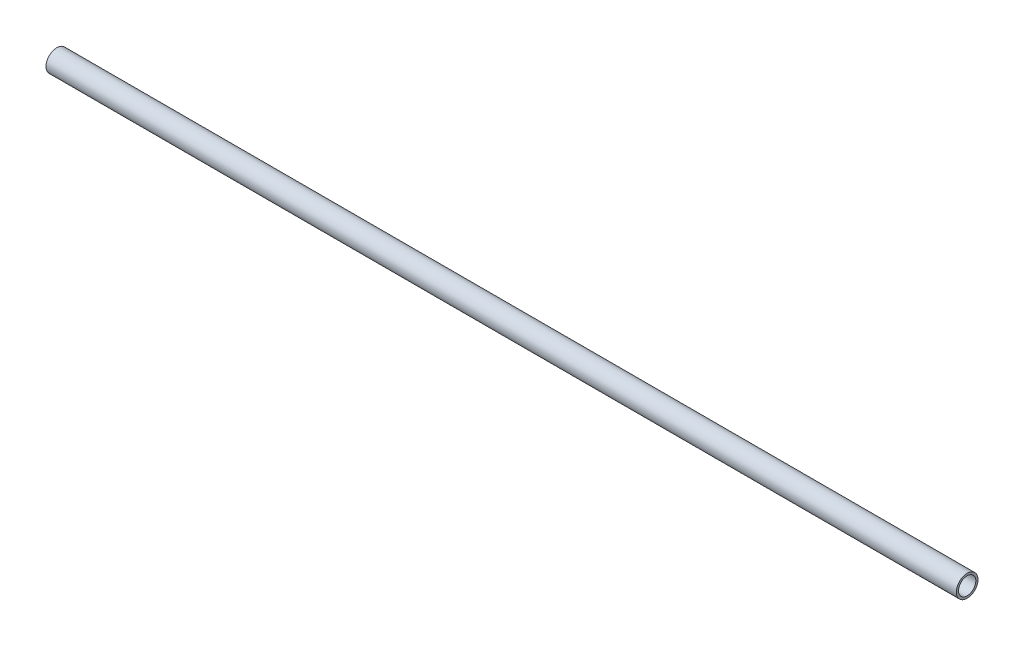
ISO-10303-21;
HEADER;
FILE_DESCRIPTION(('STEP AP214'),'2;1');
FILE_NAME('part.step','',(''),(''),'','','');
FILE_SCHEMA(('AUTOMOTIVE_DESIGN { 1 0 10303 214 1 1 1 1 }'));
ENDSEC;
DATA;
#1=APPLICATION_CONTEXT('core data for automotive mechanical design processes');
#2=APPLICATION_PROTOCOL_DEFINITION('international standard','automotive_design',2000,#1);
#3=PRODUCT_CONTEXT('',#1,'mechanical');
#4=PRODUCT('Part','Part','',(#3));
#5=PRODUCT_RELATED_PRODUCT_CATEGORY('part','',(#4));
#6=PRODUCT_DEFINITION_FORMATION('','',#4);
#7=PRODUCT_DEFINITION_CONTEXT('part definition',#1,'design');
#8=PRODUCT_DEFINITION('design','',#6,#7);
#9=PRODUCT_DEFINITION_SHAPE('','',#8);
#10=(LENGTH_UNIT() NAMED_UNIT(*) SI_UNIT(.MILLI.,.METRE.));
#11=(NAMED_UNIT(*) PLANE_ANGLE_UNIT() SI_UNIT($,.RADIAN.));
#12=(NAMED_UNIT(*) SI_UNIT($,.STERADIAN.) SOLID_ANGLE_UNIT());
#13=UNCERTAINTY_MEASURE_WITH_UNIT(LENGTH_MEASURE(1.E-05),#10,'distance_accuracy_value','');
#14=(GEOMETRIC_REPRESENTATION_CONTEXT(3) GLOBAL_UNCERTAINTY_ASSIGNED_CONTEXT((#13)) GLOBAL_UNIT_ASSIGNED_CONTEXT((#10,
#11,#12)) REPRESENTATION_CONTEXT('',''));
#15=CARTESIAN_POINT('',(0.,0.,0.));
#16=DIRECTION('',(0.,0.,1.));
#17=DIRECTION('',(1.,0.,0.));
#18=AXIS2_PLACEMENT_3D('',#15,#16,#17);
#19=CARTESIAN_POINT('',(-211.,0.,-44.));
#20=DIRECTION('',(-1.,0.,0.));
#21=DIRECTION('',(0.,1.,0.));
#22=AXIS2_PLACEMENT_3D('',#19,#20,#21);
#23=CYLINDRICAL_SURFACE('',#22,4.);
#24=CARTESIAN_POINT('',(-210.,0.,-44.));
#25=DIRECTION('',(-1.,0.,0.));
#26=DIRECTION('',(0.,1.,0.));
#27=AXIS2_PLACEMENT_3D('',#24,#25,#26);
#28=CIRCLE('',#27,4.);
#29=CARTESIAN_POINT('',(-210.,4.,-44.));
#30=VERTEX_POINT('',#29);
#31=EDGE_CURVE('E61',#30,#30,#28,.T.);
#32=ORIENTED_EDGE('',*,*,#31,.T.);
#33=DIRECTION('',(1.,0.,0.));
#34=VECTOR('',#33,1.);
#35=CARTESIAN_POINT('',(-211.,4.,-44.));
#36=LINE('',#35,#34);
#37=CARTESIAN_POINT('',(210.,4.,-44.));
#38=VERTEX_POINT('',#37);
#39=EDGE_CURVE('E9',#30,#38,#36,.T.);
#40=ORIENTED_EDGE('',*,*,#39,.T.);
#41=CARTESIAN_POINT('',(210.,0.,-44.));
#42=DIRECTION('',(-1.,0.,0.));
#43=DIRECTION('',(0.,1.,0.));
#44=AXIS2_PLACEMENT_3D('',#41,#42,#43);
#45=CIRCLE('',#44,4.);
#46=EDGE_CURVE('E24',#38,#38,#45,.T.);
#47=ORIENTED_EDGE('',*,*,#46,.F.);
#48=ORIENTED_EDGE('',*,*,#39,.F.);
#49=EDGE_LOOP('',(#32,#40,#47,#48));
#50=FACE_BOUND('',#49,.T.);
#51=ADVANCED_FACE('F15',(#50),#23,.F.);
#52=CARTESIAN_POINT('',(210.,0.,-44.));
#53=DIRECTION('',(1.,0.,0.));
#54=DIRECTION('',(0.,1.,0.));
#55=AXIS2_PLACEMENT_3D('',#52,#53,#54);
#56=PLANE('',#55);
#57=ORIENTED_EDGE('',*,*,#46,.T.);
#58=EDGE_LOOP('',(#57));
#59=FACE_BOUND('',#58,.T.);
#60=CARTESIAN_POINT('',(210.,0.,-44.));
#61=DIRECTION('',(1.,0.,0.));
#62=DIRECTION('',(0.,1.,0.));
#63=AXIS2_PLACEMENT_3D('',#60,#61,#62);
#64=CIRCLE('',#63,5.);
#65=CARTESIAN_POINT('',(210.,5.,-44.));
#66=VERTEX_POINT('',#65);
#67=EDGE_CURVE('E55',#66,#66,#64,.T.);
#68=ORIENTED_EDGE('',*,*,#67,.T.);
#69=EDGE_LOOP('',(#68));
#70=FACE_BOUND('',#69,.T.);
#71=ADVANCED_FACE('F17',(#59,#70),#56,.T.);
#72=CARTESIAN_POINT('',(-210.,0.,-44.));
#73=DIRECTION('',(1.,0.,0.));
#74=DIRECTION('',(0.,1.,0.));
#75=AXIS2_PLACEMENT_3D('',#72,#73,#74);
#76=PLANE('',#75);
#77=ORIENTED_EDGE('',*,*,#31,.F.);
#78=EDGE_LOOP('',(#77));
#79=FACE_BOUND('',#78,.T.);
#80=CARTESIAN_POINT('',(-210.,0.,-44.));
#81=DIRECTION('',(1.,0.,0.));
#82=DIRECTION('',(0.,1.,0.));
#83=AXIS2_PLACEMENT_3D('',#80,#81,#82);
#84=CIRCLE('',#83,5.);
#85=CARTESIAN_POINT('',(-210.,5.,-44.));
#86=VERTEX_POINT('',#85);
#87=EDGE_CURVE('E54',#86,#86,#84,.T.);
#88=ORIENTED_EDGE('',*,*,#87,.F.);
#89=EDGE_LOOP('',(#88));
#90=FACE_BOUND('',#89,.T.);
#91=ADVANCED_FACE('F72',(#79,#90),#76,.F.);
#92=CARTESIAN_POINT('',(-210.,0.,-44.));
#93=DIRECTION('',(-1.,0.,0.));
#94=DIRECTION('',(0.,1.,0.));
#95=AXIS2_PLACEMENT_3D('',#92,#93,#94);
#96=CYLINDRICAL_SURFACE('',#95,5.);
#97=ORIENTED_EDGE('',*,*,#87,.T.);
#98=DIRECTION('',(1.,0.,0.));
#99=VECTOR('',#98,1.);
#100=CARTESIAN_POINT('',(-210.,5.,-44.));
#101=LINE('',#100,#99);
#102=EDGE_CURVE('E51',#86,#66,#101,.T.);
#103=ORIENTED_EDGE('',*,*,#102,.T.);
#104=ORIENTED_EDGE('',*,*,#67,.F.);
#105=ORIENTED_EDGE('',*,*,#102,.F.);
#106=EDGE_LOOP('',(#97,#103,#104,#105));
#107=FACE_BOUND('',#106,.T.);
#108=ADVANCED_FACE('F52',(#107),#96,.T.);
#109=CLOSED_SHELL('',(#51,#71,#91,#108));
#110=MANIFOLD_SOLID_BREP('B1',#109);
#111=ADVANCED_BREP_SHAPE_REPRESENTATION('',(#18,#110),#14);
#112=SHAPE_DEFINITION_REPRESENTATION(#9,#111);
ENDSEC;
END-ISO-10303-21;
